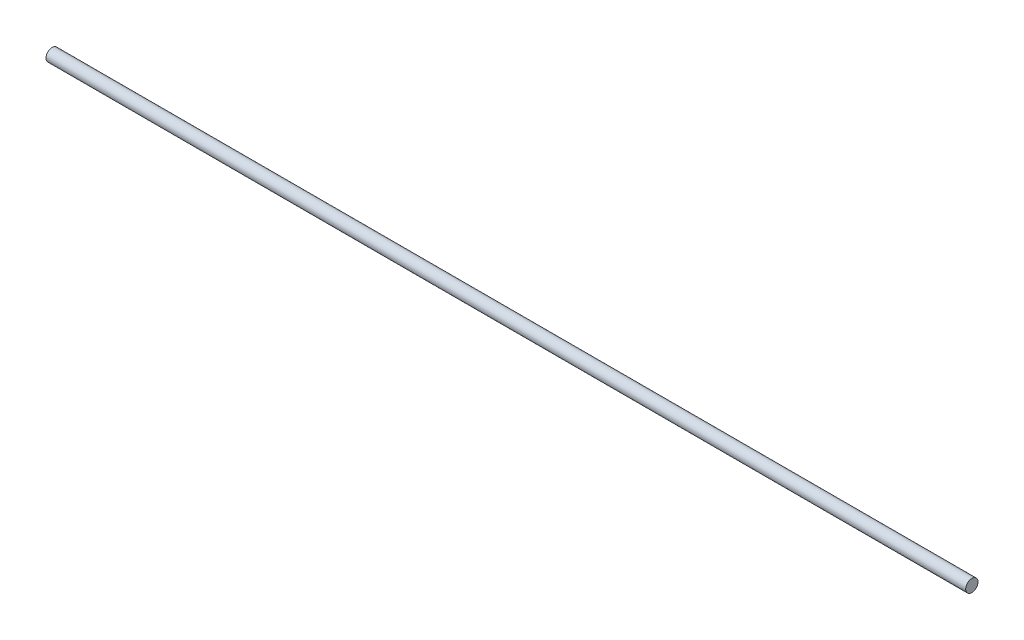
ISO-10303-21;
HEADER;
FILE_DESCRIPTION(('STEP AP214'),'2;1');
FILE_NAME('part.step','',(''),(''),'','','');
FILE_SCHEMA(('AUTOMOTIVE_DESIGN { 1 0 10303 214 1 1 1 1 }'));
ENDSEC;
DATA;
#1=APPLICATION_CONTEXT('core data for automotive mechanical design processes');
#2=APPLICATION_PROTOCOL_DEFINITION('international standard','automotive_design',2000,#1);
#3=PRODUCT_CONTEXT('',#1,'mechanical');
#4=PRODUCT('Part','Part','',(#3));
#5=PRODUCT_RELATED_PRODUCT_CATEGORY('part','',(#4));
#6=PRODUCT_DEFINITION_FORMATION('','',#4);
#7=PRODUCT_DEFINITION_CONTEXT('part definition',#1,'design');
#8=PRODUCT_DEFINITION('design','',#6,#7);
#9=PRODUCT_DEFINITION_SHAPE('','',#8);
#10=(LENGTH_UNIT() NAMED_UNIT(*) SI_UNIT(.MILLI.,.METRE.));
#11=(NAMED_UNIT(*) PLANE_ANGLE_UNIT() SI_UNIT($,.RADIAN.));
#12=(NAMED_UNIT(*) SI_UNIT($,.STERADIAN.) SOLID_ANGLE_UNIT());
#13=UNCERTAINTY_MEASURE_WITH_UNIT(LENGTH_MEASURE(1.E-05),#10,'distance_accuracy_value','');
#14=(GEOMETRIC_REPRESENTATION_CONTEXT(3) GLOBAL_UNCERTAINTY_ASSIGNED_CONTEXT((#13)) GLOBAL_UNIT_ASSIGNED_CONTEXT((#10,
#11,#12)) REPRESENTATION_CONTEXT('',''));
#15=CARTESIAN_POINT('',(0.,0.,0.));
#16=DIRECTION('',(0.,0.,1.));
#17=DIRECTION('',(1.,0.,0.));
#18=AXIS2_PLACEMENT_3D('',#15,#16,#17);
#19=CARTESIAN_POINT('',(750.,0.,0.));
#20=DIRECTION('',(-1.,0.,0.));
#21=DIRECTION('',(0.,0.,1.));
#22=AXIS2_PLACEMENT_3D('',#19,#20,#21);
#23=CYLINDRICAL_SURFACE('',#22,10.033);
#24=CARTESIAN_POINT('',(750.,0.,0.));
#25=DIRECTION('',(1.,0.,0.));
#26=DIRECTION('',(0.,0.,-1.));
#27=AXIS2_PLACEMENT_3D('',#24,#25,#26);
#28=CIRCLE('',#27,10.033);
#29=CARTESIAN_POINT('',(750.,0.,-10.033));
#30=VERTEX_POINT('',#29);
#31=EDGE_CURVE('E10',#30,#30,#28,.T.);
#32=ORIENTED_EDGE('',*,*,#31,.F.);
#33=EDGE_LOOP('',(#32));
#34=FACE_BOUND('',#33,.T.);
#35=CARTESIAN_POINT('',(-750.,0.,0.));
#36=DIRECTION('',(1.,0.,0.));
#37=DIRECTION('',(0.,0.,-1.));
#38=AXIS2_PLACEMENT_3D('',#35,#36,#37);
#39=CIRCLE('',#38,10.033);
#40=CARTESIAN_POINT('',(-750.,0.,-10.033));
#41=VERTEX_POINT('',#40);
#42=EDGE_CURVE('E46',#41,#41,#39,.T.);
#43=ORIENTED_EDGE('',*,*,#42,.T.);
#44=EDGE_LOOP('',(#43));
#45=FACE_BOUND('',#44,.T.);
#46=ADVANCED_FACE('F43',(#34,#45),#23,.T.);
#47=CARTESIAN_POINT('',(750.,0.,0.));
#48=DIRECTION('',(1.,0.,0.));
#49=DIRECTION('',(0.,0.,-1.));
#50=AXIS2_PLACEMENT_3D('',#47,#48,#49);
#51=PLANE('',#50);
#52=ORIENTED_EDGE('',*,*,#31,.T.);
#53=EDGE_LOOP('',(#52));
#54=FACE_BOUND('',#53,.T.);
#55=ADVANCED_FACE('F60',(#54),#51,.T.);
#56=CARTESIAN_POINT('',(-750.,0.,0.));
#57=DIRECTION('',(1.,0.,0.));
#58=DIRECTION('',(0.,0.,-1.));
#59=AXIS2_PLACEMENT_3D('',#56,#57,#58);
#60=PLANE('',#59);
#61=ORIENTED_EDGE('',*,*,#42,.F.);
#62=EDGE_LOOP('',(#61));
#63=FACE_BOUND('',#62,.T.);
#64=ADVANCED_FACE('F58',(#63),#60,.F.);
#65=CLOSED_SHELL('',(#46,#55,#64));
#66=MANIFOLD_SOLID_BREP('B2',#65);
#67=ADVANCED_BREP_SHAPE_REPRESENTATION('',(#18,#66),#14);
#68=SHAPE_DEFINITION_REPRESENTATION(#9,#67);
ENDSEC;
END-ISO-10303-21;
